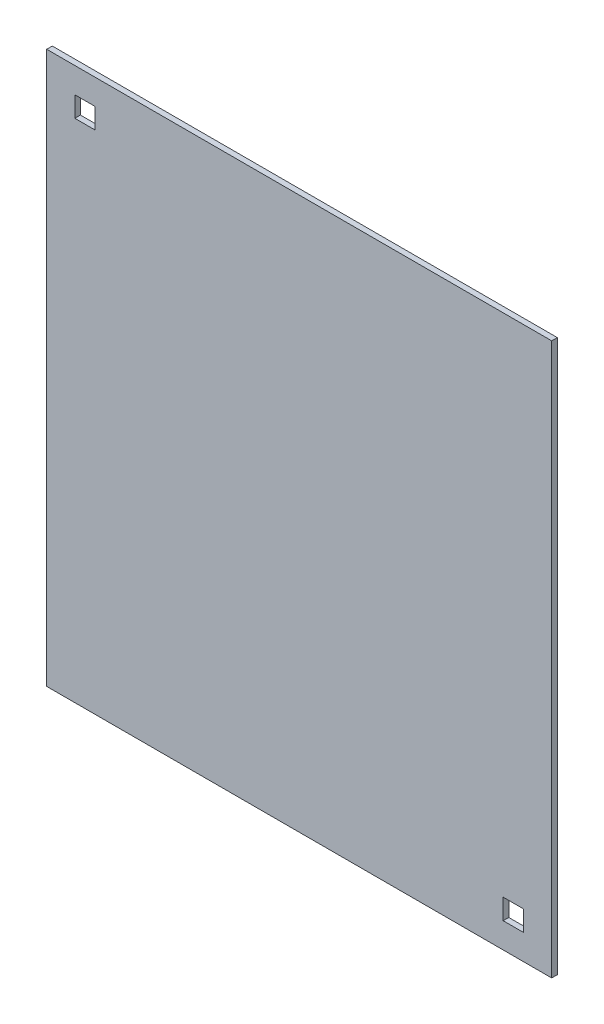
ISO-10303-21;
HEADER;
FILE_DESCRIPTION(('STEP AP214'),'2;1');
FILE_NAME('part.step','',(''),(''),'','','');
FILE_SCHEMA(('AUTOMOTIVE_DESIGN { 1 0 10303 214 1 1 1 1 }'));
ENDSEC;
DATA;
#1=APPLICATION_CONTEXT('core data for automotive mechanical design processes');
#2=APPLICATION_PROTOCOL_DEFINITION('international standard','automotive_design',2000,#1);
#3=PRODUCT_CONTEXT('',#1,'mechanical');
#4=PRODUCT('Part','Part','',(#3));
#5=PRODUCT_RELATED_PRODUCT_CATEGORY('part','',(#4));
#6=PRODUCT_DEFINITION_FORMATION('','',#4);
#7=PRODUCT_DEFINITION_CONTEXT('part definition',#1,'design');
#8=PRODUCT_DEFINITION('design','',#6,#7);
#9=PRODUCT_DEFINITION_SHAPE('','',#8);
#10=(LENGTH_UNIT() NAMED_UNIT(*) SI_UNIT(.MILLI.,.METRE.));
#11=(NAMED_UNIT(*) PLANE_ANGLE_UNIT() SI_UNIT($,.RADIAN.));
#12=(NAMED_UNIT(*) SI_UNIT($,.STERADIAN.) SOLID_ANGLE_UNIT());
#13=UNCERTAINTY_MEASURE_WITH_UNIT(LENGTH_MEASURE(1.E-05),#10,'distance_accuracy_value','');
#14=(GEOMETRIC_REPRESENTATION_CONTEXT(3) GLOBAL_UNCERTAINTY_ASSIGNED_CONTEXT((#13)) GLOBAL_UNIT_ASSIGNED_CONTEXT((#10,
#11,#12)) REPRESENTATION_CONTEXT('',''));
#15=CARTESIAN_POINT('',(0.,0.,0.));
#16=DIRECTION('',(0.,0.,1.));
#17=DIRECTION('',(1.,0.,0.));
#18=AXIS2_PLACEMENT_3D('',#15,#16,#17);
#19=CARTESIAN_POINT('',(0.,137.4394,1.524));
#20=DIRECTION('',(0.,-1.,0.));
#21=DIRECTION('',(-1.,0.,0.));
#22=AXIS2_PLACEMENT_3D('',#19,#20,#21);
#23=PLANE('',#22);
#24=DIRECTION('',(0.,0.,1.));
#25=VECTOR('',#24,1.);
#26=CARTESIAN_POINT('',(13.1826,137.4394,1.524));
#27=LINE('',#26,#25);
#28=CARTESIAN_POINT('',(13.1826,137.4394,0.));
#29=VERTEX_POINT('',#28);
#30=CARTESIAN_POINT('',(13.1826,137.4394,1.524));
#31=VERTEX_POINT('',#30);
#32=EDGE_CURVE('E11',#29,#31,#27,.T.);
#33=ORIENTED_EDGE('',*,*,#32,.F.);
#34=DIRECTION('',(-1.,0.,0.));
#35=VECTOR('',#34,1.);
#36=CARTESIAN_POINT('',(0.,137.4394,0.));
#37=LINE('',#36,#35);
#38=CARTESIAN_POINT('',(7.6454,137.4394,0.));
#39=VERTEX_POINT('',#38);
#40=EDGE_CURVE('E125',#39,#29,#37,.F.);
#41=ORIENTED_EDGE('',*,*,#40,.F.);
#42=DIRECTION('',(0.,0.,1.));
#43=VECTOR('',#42,1.);
#44=CARTESIAN_POINT('',(7.6454,137.4394,1.524));
#45=LINE('',#44,#43);
#46=CARTESIAN_POINT('',(7.6454,137.4394,1.524));
#47=VERTEX_POINT('',#46);
#48=EDGE_CURVE('E55',#39,#47,#45,.T.);
#49=ORIENTED_EDGE('',*,*,#48,.T.);
#50=DIRECTION('',(-1.,0.,0.));
#51=VECTOR('',#50,1.);
#52=CARTESIAN_POINT('',(0.,137.4394,1.524));
#53=LINE('',#52,#51);
#54=EDGE_CURVE('E184',#47,#31,#53,.F.);
#55=ORIENTED_EDGE('',*,*,#54,.T.);
#56=EDGE_LOOP('',(#33,#41,#49,#55));
#57=FACE_BOUND('',#56,.T.);
#58=ADVANCED_FACE('F44',(#57),#23,.F.);
#59=CARTESIAN_POINT('',(7.6454,0.,1.524));
#60=DIRECTION('',(-1.,0.,0.));
#61=DIRECTION('',(0.,1.,0.));
#62=AXIS2_PLACEMENT_3D('',#59,#60,#61);
#63=PLANE('',#62);
#64=ORIENTED_EDGE('',*,*,#48,.F.);
#65=DIRECTION('',(0.,1.,0.));
#66=VECTOR('',#65,1.);
#67=CARTESIAN_POINT('',(7.6454,0.,0.));
#68=LINE('',#67,#66);
#69=CARTESIAN_POINT('',(7.6454,142.9766,0.));
#70=VERTEX_POINT('',#69);
#71=EDGE_CURVE('E141',#70,#39,#68,.F.);
#72=ORIENTED_EDGE('',*,*,#71,.F.);
#73=DIRECTION('',(0.,0.,1.));
#74=VECTOR('',#73,1.);
#75=CARTESIAN_POINT('',(7.6454,142.9766,1.524));
#76=LINE('',#75,#74);
#77=CARTESIAN_POINT('',(7.6454,142.9766,1.524));
#78=VERTEX_POINT('',#77);
#79=EDGE_CURVE('E63',#70,#78,#76,.T.);
#80=ORIENTED_EDGE('',*,*,#79,.T.);
#81=DIRECTION('',(0.,1.,0.));
#82=VECTOR('',#81,1.);
#83=CARTESIAN_POINT('',(7.6454,0.,1.524));
#84=LINE('',#83,#82);
#85=EDGE_CURVE('E164',#78,#47,#84,.F.);
#86=ORIENTED_EDGE('',*,*,#85,.T.);
#87=EDGE_LOOP('',(#64,#72,#80,#86));
#88=FACE_BOUND('',#87,.T.);
#89=ADVANCED_FACE('F190',(#88),#63,.F.);
#90=CARTESIAN_POINT('',(0.,142.9766,1.524));
#91=DIRECTION('',(0.,-1.,0.));
#92=DIRECTION('',(-1.,0.,0.));
#93=AXIS2_PLACEMENT_3D('',#90,#91,#92);
#94=PLANE('',#93);
#95=ORIENTED_EDGE('',*,*,#79,.F.);
#96=DIRECTION('',(-1.,0.,0.));
#97=VECTOR('',#96,1.);
#98=CARTESIAN_POINT('',(0.,142.9766,0.));
#99=LINE('',#98,#97);
#100=CARTESIAN_POINT('',(13.1826,142.9766,0.));
#101=VERTEX_POINT('',#100);
#102=EDGE_CURVE('E124',#101,#70,#99,.T.);
#103=ORIENTED_EDGE('',*,*,#102,.F.);
#104=DIRECTION('',(0.,0.,1.));
#105=VECTOR('',#104,1.);
#106=CARTESIAN_POINT('',(13.1826,142.9766,1.524));
#107=LINE('',#106,#105);
#108=CARTESIAN_POINT('',(13.1826,142.9766,1.524));
#109=VERTEX_POINT('',#108);
#110=EDGE_CURVE('E48',#101,#109,#107,.T.);
#111=ORIENTED_EDGE('',*,*,#110,.T.);
#112=DIRECTION('',(-1.,0.,0.));
#113=VECTOR('',#112,1.);
#114=CARTESIAN_POINT('',(0.,142.9766,1.524));
#115=LINE('',#114,#113);
#116=EDGE_CURVE('E294',#109,#78,#115,.T.);
#117=ORIENTED_EDGE('',*,*,#116,.T.);
#118=EDGE_LOOP('',(#95,#103,#111,#117));
#119=FACE_BOUND('',#118,.T.);
#120=ADVANCED_FACE('F128',(#119),#94,.T.);
#121=CARTESIAN_POINT('',(0.,149.86,1.524));
#122=DIRECTION('',(0.,-1.,0.));
#123=DIRECTION('',(-1.,0.,0.));
#124=AXIS2_PLACEMENT_3D('',#121,#122,#123);
#125=PLANE('',#124);
#126=DIRECTION('',(0.,0.,1.));
#127=VECTOR('',#126,1.);
#128=CARTESIAN_POINT('',(137.16,149.86,1.524));
#129=LINE('',#128,#127);
#130=CARTESIAN_POINT('',(137.16,149.86,0.));
#131=VERTEX_POINT('',#130);
#132=CARTESIAN_POINT('',(137.16,149.86,1.524));
#133=VERTEX_POINT('',#132);
#134=EDGE_CURVE('E119',#131,#133,#129,.T.);
#135=ORIENTED_EDGE('',*,*,#134,.F.);
#136=DIRECTION('',(-1.,0.,0.));
#137=VECTOR('',#136,1.);
#138=CARTESIAN_POINT('',(0.,149.86,0.));
#139=LINE('',#138,#137);
#140=CARTESIAN_POINT('',(0.,149.86,0.));
#141=VERTEX_POINT('',#140);
#142=EDGE_CURVE('E135',#141,#131,#139,.F.);
#143=ORIENTED_EDGE('',*,*,#142,.F.);
#144=DIRECTION('',(0.,0.,1.));
#145=VECTOR('',#144,1.);
#146=CARTESIAN_POINT('',(0.,149.86,1.524));
#147=LINE('',#146,#145);
#148=CARTESIAN_POINT('',(0.,149.86,1.524));
#149=VERTEX_POINT('',#148);
#150=EDGE_CURVE('E169',#141,#149,#147,.T.);
#151=ORIENTED_EDGE('',*,*,#150,.T.);
#152=DIRECTION('',(-1.,0.,0.));
#153=VECTOR('',#152,1.);
#154=CARTESIAN_POINT('',(0.,149.86,1.524));
#155=LINE('',#154,#153);
#156=EDGE_CURVE('E288',#149,#133,#155,.F.);
#157=ORIENTED_EDGE('',*,*,#156,.T.);
#158=EDGE_LOOP('',(#135,#143,#151,#157));
#159=FACE_BOUND('',#158,.T.);
#160=ADVANCED_FACE('F308',(#159),#125,.F.);
#161=CARTESIAN_POINT('',(0.,0.,1.524));
#162=DIRECTION('',(-1.,0.,0.));
#163=DIRECTION('',(0.,1.,0.));
#164=AXIS2_PLACEMENT_3D('',#161,#162,#163);
#165=PLANE('',#164);
#166=ORIENTED_EDGE('',*,*,#150,.F.);
#167=DIRECTION('',(0.,1.,0.));
#168=VECTOR('',#167,1.);
#169=CARTESIAN_POINT('',(0.,0.,0.));
#170=LINE('',#169,#168);
#171=CARTESIAN_POINT('',(0.,0.,0.));
#172=VERTEX_POINT('',#171);
#173=EDGE_CURVE('E130',#172,#141,#170,.T.);
#174=ORIENTED_EDGE('',*,*,#173,.F.);
#175=DIRECTION('',(0.,0.,1.));
#176=VECTOR('',#175,1.);
#177=CARTESIAN_POINT('',(0.,0.,1.524));
#178=LINE('',#177,#176);
#179=CARTESIAN_POINT('',(0.,0.,1.524));
#180=VERTEX_POINT('',#179);
#181=EDGE_CURVE('E165',#172,#180,#178,.T.);
#182=ORIENTED_EDGE('',*,*,#181,.T.);
#183=DIRECTION('',(0.,1.,0.));
#184=VECTOR('',#183,1.);
#185=CARTESIAN_POINT('',(0.,0.,1.524));
#186=LINE('',#185,#184);
#187=EDGE_CURVE('E239',#180,#149,#186,.T.);
#188=ORIENTED_EDGE('',*,*,#187,.T.);
#189=EDGE_LOOP('',(#166,#174,#182,#188));
#190=FACE_BOUND('',#189,.T.);
#191=ADVANCED_FACE('F237',(#190),#165,.T.);
#192=CARTESIAN_POINT('',(0.,0.,1.524));
#193=DIRECTION('',(0.,-1.,0.));
#194=DIRECTION('',(-1.,0.,0.));
#195=AXIS2_PLACEMENT_3D('',#192,#193,#194);
#196=PLANE('',#195);
#197=ORIENTED_EDGE('',*,*,#181,.F.);
#198=DIRECTION('',(-1.,0.,0.));
#199=VECTOR('',#198,1.);
#200=CARTESIAN_POINT('',(0.,0.,0.));
#201=LINE('',#200,#199);
#202=CARTESIAN_POINT('',(137.16,0.,0.));
#203=VERTEX_POINT('',#202);
#204=EDGE_CURVE('E205',#203,#172,#201,.T.);
#205=ORIENTED_EDGE('',*,*,#204,.F.);
#206=DIRECTION('',(0.,0.,1.));
#207=VECTOR('',#206,1.);
#208=CARTESIAN_POINT('',(137.16,0.,1.524));
#209=LINE('',#208,#207);
#210=CARTESIAN_POINT('',(137.16,0.,1.524));
#211=VERTEX_POINT('',#210);
#212=EDGE_CURVE('E160',#203,#211,#209,.T.);
#213=ORIENTED_EDGE('',*,*,#212,.T.);
#214=DIRECTION('',(-1.,0.,0.));
#215=VECTOR('',#214,1.);
#216=CARTESIAN_POINT('',(0.,0.,1.524));
#217=LINE('',#216,#215);
#218=EDGE_CURVE('E233',#211,#180,#217,.T.);
#219=ORIENTED_EDGE('',*,*,#218,.T.);
#220=EDGE_LOOP('',(#197,#205,#213,#219));
#221=FACE_BOUND('',#220,.T.);
#222=ADVANCED_FACE('F228',(#221),#196,.T.);
#223=CARTESIAN_POINT('',(0.,6.8834,1.524));
#224=DIRECTION('',(0.,-1.,0.));
#225=DIRECTION('',(-1.,0.,0.));
#226=AXIS2_PLACEMENT_3D('',#223,#224,#225);
#227=PLANE('',#226);
#228=DIRECTION('',(0.,0.,1.));
#229=VECTOR('',#228,1.);
#230=CARTESIAN_POINT('',(129.5146,6.8834,1.524));
#231=LINE('',#230,#229);
#232=CARTESIAN_POINT('',(129.5146,6.8834,0.));
#233=VERTEX_POINT('',#232);
#234=CARTESIAN_POINT('',(129.5146,6.8834,1.524));
#235=VERTEX_POINT('',#234);
#236=EDGE_CURVE('E156',#233,#235,#231,.T.);
#237=ORIENTED_EDGE('',*,*,#236,.F.);
#238=DIRECTION('',(-1.,0.,0.));
#239=VECTOR('',#238,1.);
#240=CARTESIAN_POINT('',(0.,6.8834,0.));
#241=LINE('',#240,#239);
#242=CARTESIAN_POINT('',(123.9774,6.8834,0.));
#243=VERTEX_POINT('',#242);
#244=EDGE_CURVE('E206',#243,#233,#241,.F.);
#245=ORIENTED_EDGE('',*,*,#244,.F.);
#246=DIRECTION('',(0.,0.,1.));
#247=VECTOR('',#246,1.);
#248=CARTESIAN_POINT('',(123.9774,6.8834,1.524));
#249=LINE('',#248,#247);
#250=CARTESIAN_POINT('',(123.9774,6.8834,1.524));
#251=VERTEX_POINT('',#250);
#252=EDGE_CURVE('E151',#243,#251,#249,.T.);
#253=ORIENTED_EDGE('',*,*,#252,.T.);
#254=DIRECTION('',(-1.,0.,0.));
#255=VECTOR('',#254,1.);
#256=CARTESIAN_POINT('',(0.,6.8834,1.524));
#257=LINE('',#256,#255);
#258=EDGE_CURVE('E274',#251,#235,#257,.F.);
#259=ORIENTED_EDGE('',*,*,#258,.T.);
#260=EDGE_LOOP('',(#237,#245,#253,#259));
#261=FACE_BOUND('',#260,.T.);
#262=ADVANCED_FACE('F336',(#261),#227,.F.);
#263=CARTESIAN_POINT('',(123.9774,0.,1.524));
#264=DIRECTION('',(-1.,0.,0.));
#265=DIRECTION('',(0.,1.,0.));
#266=AXIS2_PLACEMENT_3D('',#263,#264,#265);
#267=PLANE('',#266);
#268=ORIENTED_EDGE('',*,*,#252,.F.);
#269=DIRECTION('',(0.,1.,0.));
#270=VECTOR('',#269,1.);
#271=CARTESIAN_POINT('',(123.9774,0.,0.));
#272=LINE('',#271,#270);
#273=CARTESIAN_POINT('',(123.9774,12.4206,0.));
#274=VERTEX_POINT('',#273);
#275=EDGE_CURVE('E201',#274,#243,#272,.F.);
#276=ORIENTED_EDGE('',*,*,#275,.F.);
#277=DIRECTION('',(0.,0.,1.));
#278=VECTOR('',#277,1.);
#279=CARTESIAN_POINT('',(123.9774,12.4206,1.524));
#280=LINE('',#279,#278);
#281=CARTESIAN_POINT('',(123.9774,12.4206,1.524));
#282=VERTEX_POINT('',#281);
#283=EDGE_CURVE('E147',#274,#282,#280,.T.);
#284=ORIENTED_EDGE('',*,*,#283,.T.);
#285=DIRECTION('',(0.,1.,0.));
#286=VECTOR('',#285,1.);
#287=CARTESIAN_POINT('',(123.9774,0.,1.524));
#288=LINE('',#287,#286);
#289=EDGE_CURVE('E269',#282,#251,#288,.F.);
#290=ORIENTED_EDGE('',*,*,#289,.T.);
#291=EDGE_LOOP('',(#268,#276,#284,#290));
#292=FACE_BOUND('',#291,.T.);
#293=ADVANCED_FACE('F340',(#292),#267,.F.);
#294=CARTESIAN_POINT('',(0.,12.4206,1.524));
#295=DIRECTION('',(0.,-1.,0.));
#296=DIRECTION('',(-1.,0.,0.));
#297=AXIS2_PLACEMENT_3D('',#294,#295,#296);
#298=PLANE('',#297);
#299=ORIENTED_EDGE('',*,*,#283,.F.);
#300=DIRECTION('',(-1.,0.,0.));
#301=VECTOR('',#300,1.);
#302=CARTESIAN_POINT('',(0.,12.4206,0.));
#303=LINE('',#302,#301);
#304=CARTESIAN_POINT('',(129.5146,12.4206,0.));
#305=VERTEX_POINT('',#304);
#306=EDGE_CURVE('E196',#305,#274,#303,.T.);
#307=ORIENTED_EDGE('',*,*,#306,.F.);
#308=DIRECTION('',(0.,0.,1.));
#309=VECTOR('',#308,1.);
#310=CARTESIAN_POINT('',(129.5146,12.4206,1.524));
#311=LINE('',#310,#309);
#312=CARTESIAN_POINT('',(129.5146,12.4206,1.524));
#313=VERTEX_POINT('',#312);
#314=EDGE_CURVE('E152',#305,#313,#311,.T.);
#315=ORIENTED_EDGE('',*,*,#314,.T.);
#316=DIRECTION('',(-1.,0.,0.));
#317=VECTOR('',#316,1.);
#318=CARTESIAN_POINT('',(0.,12.4206,1.524));
#319=LINE('',#318,#317);
#320=EDGE_CURVE('E144',#313,#282,#319,.T.);
#321=ORIENTED_EDGE('',*,*,#320,.T.);
#322=EDGE_LOOP('',(#299,#307,#315,#321));
#323=FACE_BOUND('',#322,.T.);
#324=ADVANCED_FACE('F257',(#323),#298,.T.);
#325=CARTESIAN_POINT('',(129.5146,0.,1.524));
#326=DIRECTION('',(-1.,0.,0.));
#327=DIRECTION('',(0.,1.,0.));
#328=AXIS2_PLACEMENT_3D('',#325,#326,#327);
#329=PLANE('',#328);
#330=DIRECTION('',(0.,1.,0.));
#331=VECTOR('',#330,1.);
#332=CARTESIAN_POINT('',(129.5146,0.,0.));
#333=LINE('',#332,#331);
#334=EDGE_CURVE('E200',#233,#305,#333,.T.);
#335=ORIENTED_EDGE('',*,*,#334,.F.);
#336=ORIENTED_EDGE('',*,*,#236,.T.);
#337=DIRECTION('',(0.,1.,0.));
#338=VECTOR('',#337,1.);
#339=CARTESIAN_POINT('',(129.5146,0.,1.524));
#340=LINE('',#339,#338);
#341=EDGE_CURVE('E266',#235,#313,#340,.T.);
#342=ORIENTED_EDGE('',*,*,#341,.T.);
#343=ORIENTED_EDGE('',*,*,#314,.F.);
#344=EDGE_LOOP('',(#335,#336,#342,#343));
#345=FACE_BOUND('',#344,.T.);
#346=ADVANCED_FACE('F272',(#345),#329,.T.);
#347=CARTESIAN_POINT('',(137.16,0.,1.524));
#348=DIRECTION('',(-1.,0.,0.));
#349=DIRECTION('',(0.,1.,0.));
#350=AXIS2_PLACEMENT_3D('',#347,#348,#349);
#351=PLANE('',#350);
#352=DIRECTION('',(0.,1.,0.));
#353=VECTOR('',#352,1.);
#354=CARTESIAN_POINT('',(137.16,0.,0.));
#355=LINE('',#354,#353);
#356=EDGE_CURVE('E139',#131,#203,#355,.F.);
#357=ORIENTED_EDGE('',*,*,#356,.F.);
#358=ORIENTED_EDGE('',*,*,#134,.T.);
#359=DIRECTION('',(0.,1.,0.));
#360=VECTOR('',#359,1.);
#361=CARTESIAN_POINT('',(137.16,0.,1.524));
#362=LINE('',#361,#360);
#363=EDGE_CURVE('E284',#133,#211,#362,.F.);
#364=ORIENTED_EDGE('',*,*,#363,.T.);
#365=ORIENTED_EDGE('',*,*,#212,.F.);
#366=EDGE_LOOP('',(#357,#358,#364,#365));
#367=FACE_BOUND('',#366,.T.);
#368=ADVANCED_FACE('F310',(#367),#351,.F.);
#369=CARTESIAN_POINT('',(13.1826,0.,1.524));
#370=DIRECTION('',(-1.,0.,0.));
#371=DIRECTION('',(0.,1.,0.));
#372=AXIS2_PLACEMENT_3D('',#369,#370,#371);
#373=PLANE('',#372);
#374=DIRECTION('',(0.,1.,0.));
#375=VECTOR('',#374,1.);
#376=CARTESIAN_POINT('',(13.1826,0.,0.));
#377=LINE('',#376,#375);
#378=EDGE_CURVE('E111',#29,#101,#377,.T.);
#379=ORIENTED_EDGE('',*,*,#378,.F.);
#380=ORIENTED_EDGE('',*,*,#32,.T.);
#381=DIRECTION('',(0.,1.,0.));
#382=VECTOR('',#381,1.);
#383=CARTESIAN_POINT('',(13.1826,0.,1.524));
#384=LINE('',#383,#382);
#385=EDGE_CURVE('E114',#31,#109,#384,.T.);
#386=ORIENTED_EDGE('',*,*,#385,.T.);
#387=ORIENTED_EDGE('',*,*,#110,.F.);
#388=EDGE_LOOP('',(#379,#380,#386,#387));
#389=FACE_BOUND('',#388,.T.);
#390=ADVANCED_FACE('F46',(#389),#373,.T.);
#391=CARTESIAN_POINT('',(0.,0.,1.524));
#392=DIRECTION('',(0.,0.,-1.));
#393=DIRECTION('',(-1.,0.,0.));
#394=AXIS2_PLACEMENT_3D('',#391,#392,#393);
#395=PLANE('',#394);
#396=ORIENTED_EDGE('',*,*,#320,.F.);
#397=ORIENTED_EDGE('',*,*,#341,.F.);
#398=ORIENTED_EDGE('',*,*,#258,.F.);
#399=ORIENTED_EDGE('',*,*,#289,.F.);
#400=EDGE_LOOP('',(#396,#397,#398,#399));
#401=FACE_BOUND('',#400,.T.);
#402=ORIENTED_EDGE('',*,*,#218,.F.);
#403=ORIENTED_EDGE('',*,*,#363,.F.);
#404=ORIENTED_EDGE('',*,*,#156,.F.);
#405=ORIENTED_EDGE('',*,*,#187,.F.);
#406=EDGE_LOOP('',(#402,#403,#404,#405));
#407=FACE_BOUND('',#406,.T.);
#408=ORIENTED_EDGE('',*,*,#116,.F.);
#409=ORIENTED_EDGE('',*,*,#385,.F.);
#410=ORIENTED_EDGE('',*,*,#54,.F.);
#411=ORIENTED_EDGE('',*,*,#85,.F.);
#412=EDGE_LOOP('',(#408,#409,#410,#411));
#413=FACE_BOUND('',#412,.T.);
#414=ADVANCED_FACE('F187',(#401,#407,#413),#395,.F.);
#415=CARTESIAN_POINT('',(0.,0.,0.));
#416=DIRECTION('',(0.,0.,-1.));
#417=DIRECTION('',(-1.,0.,0.));
#418=AXIS2_PLACEMENT_3D('',#415,#416,#417);
#419=PLANE('',#418);
#420=ORIENTED_EDGE('',*,*,#306,.T.);
#421=ORIENTED_EDGE('',*,*,#275,.T.);
#422=ORIENTED_EDGE('',*,*,#244,.T.);
#423=ORIENTED_EDGE('',*,*,#334,.T.);
#424=EDGE_LOOP('',(#420,#421,#422,#423));
#425=FACE_BOUND('',#424,.T.);
#426=ORIENTED_EDGE('',*,*,#204,.T.);
#427=ORIENTED_EDGE('',*,*,#173,.T.);
#428=ORIENTED_EDGE('',*,*,#142,.T.);
#429=ORIENTED_EDGE('',*,*,#356,.T.);
#430=EDGE_LOOP('',(#426,#427,#428,#429));
#431=FACE_BOUND('',#430,.T.);
#432=ORIENTED_EDGE('',*,*,#102,.T.);
#433=ORIENTED_EDGE('',*,*,#71,.T.);
#434=ORIENTED_EDGE('',*,*,#40,.T.);
#435=ORIENTED_EDGE('',*,*,#378,.T.);
#436=EDGE_LOOP('',(#432,#433,#434,#435));
#437=FACE_BOUND('',#436,.T.);
#438=ADVANCED_FACE('F122',(#425,#431,#437),#419,.T.);
#439=CLOSED_SHELL('',(#58,#89,#120,#160,#191,#222,#262,#293,#324,#346,#368,#390,#414,#438));
#440=MANIFOLD_SOLID_BREP('B2',#439);
#441=ADVANCED_BREP_SHAPE_REPRESENTATION('',(#18,#440),#14);
#442=SHAPE_DEFINITION_REPRESENTATION(#9,#441);
ENDSEC;
END-ISO-10303-21;
